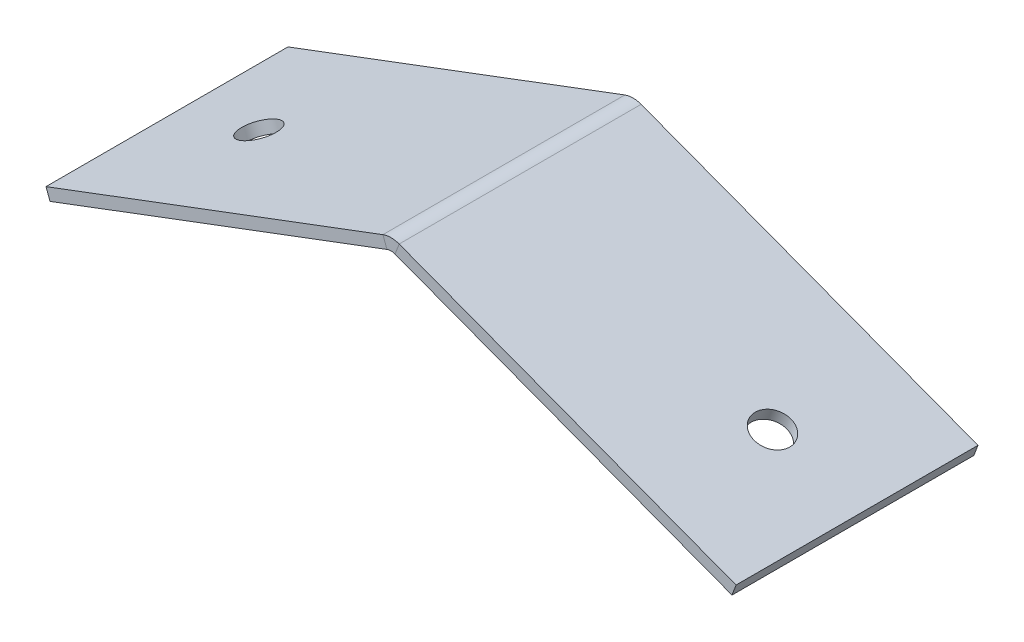
ISO-10303-21;
HEADER;
FILE_DESCRIPTION(('STEP AP214'),'2;1');
FILE_NAME('part.step','',(''),(''),'','','');
FILE_SCHEMA(('AUTOMOTIVE_DESIGN { 1 0 10303 214 1 1 1 1 }'));
ENDSEC;
DATA;
#1=APPLICATION_CONTEXT('core data for automotive mechanical design processes');
#2=APPLICATION_PROTOCOL_DEFINITION('international standard','automotive_design',2000,#1);
#3=PRODUCT_CONTEXT('',#1,'mechanical');
#4=PRODUCT('Part','Part','',(#3));
#5=PRODUCT_RELATED_PRODUCT_CATEGORY('part','',(#4));
#6=PRODUCT_DEFINITION_FORMATION('','',#4);
#7=PRODUCT_DEFINITION_CONTEXT('part definition',#1,'design');
#8=PRODUCT_DEFINITION('design','',#6,#7);
#9=PRODUCT_DEFINITION_SHAPE('','',#8);
#10=(LENGTH_UNIT() NAMED_UNIT(*) SI_UNIT(.MILLI.,.METRE.));
#11=(NAMED_UNIT(*) PLANE_ANGLE_UNIT() SI_UNIT($,.RADIAN.));
#12=(NAMED_UNIT(*) SI_UNIT($,.STERADIAN.) SOLID_ANGLE_UNIT());
#13=UNCERTAINTY_MEASURE_WITH_UNIT(LENGTH_MEASURE(1.E-05),#10,'distance_accuracy_value','');
#14=(GEOMETRIC_REPRESENTATION_CONTEXT(3) GLOBAL_UNCERTAINTY_ASSIGNED_CONTEXT((#13)) GLOBAL_UNIT_ASSIGNED_CONTEXT((#10,
#11,#12)) REPRESENTATION_CONTEXT('',''));
#15=CARTESIAN_POINT('',(0.,0.,0.));
#16=DIRECTION('',(0.,0.,1.));
#17=DIRECTION('',(1.,0.,0.));
#18=AXIS2_PLACEMENT_3D('',#15,#16,#17);
#19=CARTESIAN_POINT('',(48.6611125360654,17.477308656517,16.66875));
#20=DIRECTION('',(0.,0.,1.));
#21=DIRECTION('',(1.,0.,0.));
#22=AXIS2_PLACEMENT_3D('',#19,#20,#21);
#23=PLANE('',#22);
#24=DIRECTION('',(-0.352331719779417,-0.935875183578066,0.));
#25=VECTOR('',#24,1.);
#26=CARTESIAN_POINT('',(48.6611125360654,17.477308656517,16.66875));
#27=LINE('',#26,#25);
#28=CARTESIAN_POINT('',(48.6611125360654,17.477308656517,16.66875));
#29=VERTEX_POINT('',#28);
#30=CARTESIAN_POINT('',(48.1017859309156,15.9916068025868,16.66875));
#31=VERTEX_POINT('',#30);
#32=EDGE_CURVE('E11',#29,#31,#27,.T.);
#33=ORIENTED_EDGE('',*,*,#32,.F.);
#34=CARTESIAN_POINT('',(47.5424593257657,14.5059049486566,16.66875));
#35=DIRECTION('',(0.,0.,1.));
#36=DIRECTION('',(1.,0.,0.));
#37=AXIS2_PLACEMENT_3D('',#34,#35,#36);
#38=CIRCLE('',#37,3.175);
#39=CARTESIAN_POINT('',(46.4238061154661,17.477308656517,16.66875));
#40=VERTEX_POINT('',#39);
#41=EDGE_CURVE('E133',#40,#29,#38,.F.);
#42=ORIENTED_EDGE('',*,*,#41,.F.);
#43=DIRECTION('',(-0.352331719779419,0.935875183578065,0.));
#44=VECTOR('',#43,1.);
#45=CARTESIAN_POINT('',(46.9831327206159,15.9916068025868,16.66875));
#46=LINE('',#45,#44);
#47=CARTESIAN_POINT('',(46.9831327206159,15.9916068025868,16.66875));
#48=VERTEX_POINT('',#47);
#49=EDGE_CURVE('E44',#48,#40,#46,.T.);
#50=ORIENTED_EDGE('',*,*,#49,.F.);
#51=CARTESIAN_POINT('',(47.5424593257657,14.5059049486566,16.66875));
#52=DIRECTION('',(0.,0.,1.));
#53=DIRECTION('',(1.,0.,0.));
#54=AXIS2_PLACEMENT_3D('',#51,#52,#53);
#55=CIRCLE('',#54,1.5875);
#56=EDGE_CURVE('E126',#48,#31,#55,.F.);
#57=ORIENTED_EDGE('',*,*,#56,.T.);
#58=EDGE_LOOP('',(#33,#42,#50,#57));
#59=FACE_BOUND('',#58,.T.);
#60=ADVANCED_FACE('F36',(#59),#23,.T.);
#61=CARTESIAN_POINT('',(46.9831327206159,15.9916068025868,16.66875));
#62=DIRECTION('',(0.,0.,1.));
#63=DIRECTION('',(1.,0.,0.));
#64=AXIS2_PLACEMENT_3D('',#61,#62,#63);
#65=PLANE('',#64);
#66=DIRECTION('',(0.935875183578066,-0.352331719779416,0.));
#67=VECTOR('',#66,1.);
#68=CARTESIAN_POINT('',(47.5424593257658,17.8984513647943,16.66875));
#69=LINE('',#68,#67);
#70=CARTESIAN_POINT('',(95.0849186515315,0.,16.66875));
#71=VERTEX_POINT('',#70);
#72=EDGE_CURVE('E183',#29,#71,#69,.T.);
#73=ORIENTED_EDGE('',*,*,#72,.F.);
#74=ORIENTED_EDGE('',*,*,#32,.T.);
#75=DIRECTION('',(0.935875183578066,-0.352331719779416,0.));
#76=VECTOR('',#75,1.);
#77=CARTESIAN_POINT('',(46.9831327206159,16.4127495108642,16.66875));
#78=LINE('',#77,#76);
#79=CARTESIAN_POINT('',(94.5255920463817,-1.48570185393019,16.66875));
#80=VERTEX_POINT('',#79);
#81=EDGE_CURVE('E92',#31,#80,#78,.T.);
#82=ORIENTED_EDGE('',*,*,#81,.T.);
#83=DIRECTION('',(-0.352331719779404,-0.935875183578071,0.));
#84=VECTOR('',#83,1.);
#85=CARTESIAN_POINT('',(95.0849186515315,0.,16.66875));
#86=LINE('',#85,#84);
#87=EDGE_CURVE('E379',#71,#80,#86,.T.);
#88=ORIENTED_EDGE('',*,*,#87,.F.);
#89=EDGE_LOOP('',(#73,#74,#82,#88));
#90=FACE_BOUND('',#89,.T.);
#91=ADVANCED_FACE('F191',(#90),#65,.T.);
#92=CARTESIAN_POINT('',(46.4238061154661,17.477308656517,-16.66875));
#93=DIRECTION('',(0.,0.,-1.));
#94=DIRECTION('',(-1.,0.,0.));
#95=AXIS2_PLACEMENT_3D('',#92,#93,#94);
#96=PLANE('',#95);
#97=DIRECTION('',(0.352331719779419,-0.935875183578065,0.));
#98=VECTOR('',#97,1.);
#99=CARTESIAN_POINT('',(46.4238061154661,17.477308656517,-16.66875));
#100=LINE('',#99,#98);
#101=CARTESIAN_POINT('',(46.4238061154661,17.477308656517,-16.66875));
#102=VERTEX_POINT('',#101);
#103=CARTESIAN_POINT('',(46.9831327206159,15.9916068025868,-16.66875));
#104=VERTEX_POINT('',#103);
#105=EDGE_CURVE('E79',#102,#104,#100,.T.);
#106=ORIENTED_EDGE('',*,*,#105,.F.);
#107=CARTESIAN_POINT('',(47.5424593257657,14.5059049486566,-16.66875));
#108=DIRECTION('',(0.,0.,1.));
#109=DIRECTION('',(1.,0.,0.));
#110=AXIS2_PLACEMENT_3D('',#107,#108,#109);
#111=CIRCLE('',#110,3.175);
#112=CARTESIAN_POINT('',(48.6611125360654,17.477308656517,-16.66875));
#113=VERTEX_POINT('',#112);
#114=EDGE_CURVE('E149',#102,#113,#111,.F.);
#115=ORIENTED_EDGE('',*,*,#114,.T.);
#116=DIRECTION('',(0.352331719779417,0.935875183578066,0.));
#117=VECTOR('',#116,1.);
#118=CARTESIAN_POINT('',(48.1017859309156,15.9916068025868,-16.66875));
#119=LINE('',#118,#117);
#120=CARTESIAN_POINT('',(48.1017859309156,15.9916068025868,-16.66875));
#121=VERTEX_POINT('',#120);
#122=EDGE_CURVE('E86',#121,#113,#119,.T.);
#123=ORIENTED_EDGE('',*,*,#122,.F.);
#124=CARTESIAN_POINT('',(47.5424593257657,14.5059049486566,-16.66875));
#125=DIRECTION('',(0.,0.,1.));
#126=DIRECTION('',(1.,0.,0.));
#127=AXIS2_PLACEMENT_3D('',#124,#125,#126);
#128=CIRCLE('',#127,1.5875);
#129=EDGE_CURVE('E156',#104,#121,#128,.F.);
#130=ORIENTED_EDGE('',*,*,#129,.F.);
#131=EDGE_LOOP('',(#106,#115,#123,#130));
#132=FACE_BOUND('',#131,.T.);
#133=ADVANCED_FACE('F189',(#132),#96,.T.);
#134=CARTESIAN_POINT('',(48.1017859309156,15.9916068025868,-16.66875));
#135=DIRECTION('',(0.,0.,-1.));
#136=DIRECTION('',(-1.,0.,0.));
#137=AXIS2_PLACEMENT_3D('',#134,#135,#136);
#138=PLANE('',#137);
#139=DIRECTION('',(0.935875183578066,0.352331719779416,0.));
#140=VECTOR('',#139,1.);
#141=CARTESIAN_POINT('',(0.,0.,-16.66875));
#142=LINE('',#141,#140);
#143=CARTESIAN_POINT('',(0.,0.,-16.66875));
#144=VERTEX_POINT('',#143);
#145=EDGE_CURVE('E151',#144,#102,#142,.T.);
#146=ORIENTED_EDGE('',*,*,#145,.T.);
#147=ORIENTED_EDGE('',*,*,#105,.T.);
#148=DIRECTION('',(0.935875183578066,0.352331719779416,0.));
#149=VECTOR('',#148,1.);
#150=CARTESIAN_POINT('',(0.559326605149823,-1.48570185393018,-16.66875));
#151=LINE('',#150,#149);
#152=CARTESIAN_POINT('',(0.559326605149823,-1.48570185393018,-16.66875));
#153=VERTEX_POINT('',#152);
#154=EDGE_CURVE('E154',#153,#104,#151,.T.);
#155=ORIENTED_EDGE('',*,*,#154,.F.);
#156=DIRECTION('',(-0.352331719779416,0.935875183578066,0.));
#157=VECTOR('',#156,1.);
#158=CARTESIAN_POINT('',(0.559326605149823,-1.48570185393018,-16.66875));
#159=LINE('',#158,#157);
#160=EDGE_CURVE('E114',#153,#144,#159,.T.);
#161=ORIENTED_EDGE('',*,*,#160,.T.);
#162=EDGE_LOOP('',(#146,#147,#155,#161));
#163=FACE_BOUND('',#162,.T.);
#164=ADVANCED_FACE('F185',(#163),#138,.T.);
#165=CARTESIAN_POINT('',(46.9831327206159,16.4127495108642,16.66875));
#166=DIRECTION('',(0.352331719779416,0.935875183578066,0.));
#167=DIRECTION('',(-0.935875183578066,0.352331719779416,0.));
#168=AXIS2_PLACEMENT_3D('',#165,#166,#167);
#169=PLANE('',#168);
#170=CARTESIAN_POINT('',(82.8776895115691,2.89941873044442,0.));
#171=DIRECTION('',(0.352331719779416,0.935875183578066,0.));
#172=DIRECTION('',(-0.935875183578066,0.352331719779416,0.));
#173=AXIS2_PLACEMENT_3D('',#170,#171,#172);
#174=CIRCLE('',#173,2.53999999999999);
#175=CARTESIAN_POINT('',(80.5005665452808,3.79434129868414,0.));
#176=VERTEX_POINT('',#175);
#177=EDGE_CURVE('E366',#176,#176,#174,.T.);
#178=ORIENTED_EDGE('',*,*,#177,.T.);
#179=EDGE_LOOP('',(#178));
#180=FACE_BOUND('',#179,.T.);
#181=DIRECTION('',(0.935875183578066,-0.352331719779416,0.));
#182=VECTOR('',#181,1.);
#183=CARTESIAN_POINT('',(46.9831327206159,16.4127495108642,-16.66875));
#184=LINE('',#183,#182);
#185=CARTESIAN_POINT('',(94.5255920463817,-1.48570185393019,-16.66875));
#186=VERTEX_POINT('',#185);
#187=EDGE_CURVE('E139',#121,#186,#184,.T.);
#188=ORIENTED_EDGE('',*,*,#187,.T.);
#189=DIRECTION('',(0.,0.,-1.));
#190=VECTOR('',#189,1.);
#191=CARTESIAN_POINT('',(94.5255920463817,-1.48570185393019,16.66875));
#192=LINE('',#191,#190);
#193=EDGE_CURVE('E170',#80,#186,#192,.T.);
#194=ORIENTED_EDGE('',*,*,#193,.F.);
#195=ORIENTED_EDGE('',*,*,#81,.F.);
#196=DIRECTION('',(0.,0.,-1.));
#197=VECTOR('',#196,1.);
#198=CARTESIAN_POINT('',(48.1017859309156,15.9916068025868,16.66875));
#199=LINE('',#198,#197);
#200=EDGE_CURVE('E138',#31,#121,#199,.T.);
#201=ORIENTED_EDGE('',*,*,#200,.T.);
#202=EDGE_LOOP('',(#188,#194,#195,#201));
#203=FACE_BOUND('',#202,.T.);
#204=ADVANCED_FACE('F197',(#180,#203),#169,.F.);
#205=CARTESIAN_POINT('',(95.0849186515315,0.,16.66875));
#206=DIRECTION('',(0.93587518357807,-0.352331719779404,0.));
#207=DIRECTION('',(0.352331719779404,0.935875183578071,0.));
#208=AXIS2_PLACEMENT_3D('',#205,#206,#207);
#209=PLANE('',#208);
#210=DIRECTION('',(-0.352331719779404,-0.935875183578071,0.));
#211=VECTOR('',#210,1.);
#212=CARTESIAN_POINT('',(95.0849186515315,0.,-16.66875));
#213=LINE('',#212,#211);
#214=CARTESIAN_POINT('',(95.0849186515315,0.,-16.66875));
#215=VERTEX_POINT('',#214);
#216=EDGE_CURVE('E142',#215,#186,#213,.T.);
#217=ORIENTED_EDGE('',*,*,#216,.F.);
#218=DIRECTION('',(0.,0.,-1.));
#219=VECTOR('',#218,1.);
#220=CARTESIAN_POINT('',(95.0849186515315,0.,16.66875));
#221=LINE('',#220,#219);
#222=EDGE_CURVE('E168',#71,#215,#221,.T.);
#223=ORIENTED_EDGE('',*,*,#222,.F.);
#224=ORIENTED_EDGE('',*,*,#87,.T.);
#225=ORIENTED_EDGE('',*,*,#193,.T.);
#226=EDGE_LOOP('',(#217,#223,#224,#225));
#227=FACE_BOUND('',#226,.T.);
#228=ADVANCED_FACE('F226',(#227),#209,.T.);
#229=CARTESIAN_POINT('',(47.5424593257658,17.8984513647943,16.66875));
#230=DIRECTION('',(0.352331719779416,0.935875183578066,0.));
#231=DIRECTION('',(-0.935875183578066,0.352331719779416,0.));
#232=AXIS2_PLACEMENT_3D('',#229,#230,#231);
#233=PLANE('',#232);
#234=CARTESIAN_POINT('',(83.4370161167189,4.3851205843746,0.));
#235=DIRECTION('',(0.352331719779416,0.935875183578066,0.));
#236=DIRECTION('',(-0.935875183578066,0.352331719779416,0.));
#237=AXIS2_PLACEMENT_3D('',#234,#235,#236);
#238=CIRCLE('',#237,2.53999999999999);
#239=CARTESIAN_POINT('',(81.0598931504306,5.28004315261432,0.));
#240=VERTEX_POINT('',#239);
#241=EDGE_CURVE('E369',#240,#240,#238,.T.);
#242=ORIENTED_EDGE('',*,*,#241,.F.);
#243=EDGE_LOOP('',(#242));
#244=FACE_BOUND('',#243,.T.);
#245=DIRECTION('',(0.935875183578066,-0.352331719779416,0.));
#246=VECTOR('',#245,1.);
#247=CARTESIAN_POINT('',(47.5424593257658,17.8984513647943,-16.66875));
#248=LINE('',#247,#246);
#249=EDGE_CURVE('E146',#113,#215,#248,.T.);
#250=ORIENTED_EDGE('',*,*,#249,.F.);
#251=DIRECTION('',(0.,0.,-1.));
#252=VECTOR('',#251,1.);
#253=CARTESIAN_POINT('',(48.6611125360654,17.477308656517,16.66875));
#254=LINE('',#253,#252);
#255=EDGE_CURVE('E165',#29,#113,#254,.T.);
#256=ORIENTED_EDGE('',*,*,#255,.F.);
#257=ORIENTED_EDGE('',*,*,#72,.T.);
#258=ORIENTED_EDGE('',*,*,#222,.T.);
#259=EDGE_LOOP('',(#250,#256,#257,#258));
#260=FACE_BOUND('',#259,.T.);
#261=ADVANCED_FACE('F231',(#244,#260),#233,.T.);
#262=CARTESIAN_POINT('',(47.5424593257657,14.5059049486566,16.66875));
#263=DIRECTION('',(0.,0.,-1.));
#264=DIRECTION('',(-1.,0.,0.));
#265=AXIS2_PLACEMENT_3D('',#262,#263,#264);
#266=CYLINDRICAL_SURFACE('',#265,3.175);
#267=ORIENTED_EDGE('',*,*,#114,.F.);
#268=DIRECTION('',(0.,0.,-1.));
#269=VECTOR('',#268,1.);
#270=CARTESIAN_POINT('',(46.4238061154661,17.477308656517,16.66875));
#271=LINE('',#270,#269);
#272=EDGE_CURVE('E162',#40,#102,#271,.T.);
#273=ORIENTED_EDGE('',*,*,#272,.F.);
#274=ORIENTED_EDGE('',*,*,#41,.T.);
#275=ORIENTED_EDGE('',*,*,#255,.T.);
#276=EDGE_LOOP('',(#267,#273,#274,#275));
#277=FACE_BOUND('',#276,.T.);
#278=ADVANCED_FACE('F179',(#277),#266,.T.);
#279=CARTESIAN_POINT('',(0.,0.,16.66875));
#280=DIRECTION('',(-0.352331719779416,0.935875183578066,0.));
#281=DIRECTION('',(-0.935875183578066,-0.352331719779416,0.));
#282=AXIS2_PLACEMENT_3D('',#279,#280,#281);
#283=PLANE('',#282);
#284=CARTESIAN_POINT('',(12.6686599941724,4.76940818751299,0.));
#285=DIRECTION('',(-0.352331719779416,0.935875183578066,0.));
#286=DIRECTION('',(-0.935875183578066,-0.352331719779416,0.));
#287=AXIS2_PLACEMENT_3D('',#284,#285,#286);
#288=CIRCLE('',#287,2.54);
#289=CARTESIAN_POINT('',(10.2915370278841,3.87448561927327,0.));
#290=VERTEX_POINT('',#289);
#291=EDGE_CURVE('E371',#290,#290,#288,.T.);
#292=ORIENTED_EDGE('',*,*,#291,.F.);
#293=EDGE_LOOP('',(#292));
#294=FACE_BOUND('',#293,.T.);
#295=ORIENTED_EDGE('',*,*,#145,.F.);
#296=DIRECTION('',(0.,0.,-1.));
#297=VECTOR('',#296,1.);
#298=CARTESIAN_POINT('',(0.,0.,16.66875));
#299=LINE('',#298,#297);
#300=CARTESIAN_POINT('',(0.,0.,16.66875));
#301=VERTEX_POINT('',#300);
#302=EDGE_CURVE('E116',#301,#144,#299,.T.);
#303=ORIENTED_EDGE('',*,*,#302,.F.);
#304=DIRECTION('',(0.935875183578066,0.352331719779416,0.));
#305=VECTOR('',#304,1.);
#306=CARTESIAN_POINT('',(0.,0.,16.66875));
#307=LINE('',#306,#305);
#308=EDGE_CURVE('E131',#301,#40,#307,.T.);
#309=ORIENTED_EDGE('',*,*,#308,.T.);
#310=ORIENTED_EDGE('',*,*,#272,.T.);
#311=EDGE_LOOP('',(#295,#303,#309,#310));
#312=FACE_BOUND('',#311,.T.);
#313=ADVANCED_FACE('F184',(#294,#312),#283,.T.);
#314=CARTESIAN_POINT('',(0.559326605149823,-1.48570185393018,16.66875));
#315=DIRECTION('',(-0.935875183578066,-0.352331719779416,0.));
#316=DIRECTION('',(0.352331719779416,-0.935875183578066,0.));
#317=AXIS2_PLACEMENT_3D('',#314,#315,#316);
#318=PLANE('',#317);
#319=ORIENTED_EDGE('',*,*,#160,.F.);
#320=DIRECTION('',(0.,0.,-1.));
#321=VECTOR('',#320,1.);
#322=CARTESIAN_POINT('',(0.559326605149823,-1.48570185393018,16.66875));
#323=LINE('',#322,#321);
#324=CARTESIAN_POINT('',(0.559326605149823,-1.48570185393018,16.66875));
#325=VERTEX_POINT('',#324);
#326=EDGE_CURVE('E108',#325,#153,#323,.T.);
#327=ORIENTED_EDGE('',*,*,#326,.F.);
#328=DIRECTION('',(-0.352331719779416,0.935875183578066,0.));
#329=VECTOR('',#328,1.);
#330=CARTESIAN_POINT('',(0.559326605149823,-1.48570185393018,16.66875));
#331=LINE('',#330,#329);
#332=EDGE_CURVE('E112',#325,#301,#331,.T.);
#333=ORIENTED_EDGE('',*,*,#332,.T.);
#334=ORIENTED_EDGE('',*,*,#302,.T.);
#335=EDGE_LOOP('',(#319,#327,#333,#334));
#336=FACE_BOUND('',#335,.T.);
#337=ADVANCED_FACE('F110',(#336),#318,.T.);
#338=CARTESIAN_POINT('',(0.559326605149823,-1.48570185393018,16.66875));
#339=DIRECTION('',(-0.352331719779416,0.935875183578066,0.));
#340=DIRECTION('',(-0.935875183578066,-0.352331719779416,0.));
#341=AXIS2_PLACEMENT_3D('',#338,#339,#340);
#342=PLANE('',#341);
#343=CARTESIAN_POINT('',(13.2279865993222,3.28370633358281,0.));
#344=DIRECTION('',(-0.352331719779416,0.935875183578066,0.));
#345=DIRECTION('',(-0.935875183578066,-0.352331719779416,0.));
#346=AXIS2_PLACEMENT_3D('',#343,#344,#345);
#347=CIRCLE('',#346,2.54);
#348=CARTESIAN_POINT('',(10.8508636330339,2.3887837653431,0.));
#349=VERTEX_POINT('',#348);
#350=EDGE_CURVE('E143',#349,#349,#347,.T.);
#351=ORIENTED_EDGE('',*,*,#350,.T.);
#352=EDGE_LOOP('',(#351));
#353=FACE_BOUND('',#352,.T.);
#354=ORIENTED_EDGE('',*,*,#154,.T.);
#355=DIRECTION('',(0.,0.,-1.));
#356=VECTOR('',#355,1.);
#357=CARTESIAN_POINT('',(46.9831327206159,15.9916068025868,16.66875));
#358=LINE('',#357,#356);
#359=EDGE_CURVE('E117',#48,#104,#358,.T.);
#360=ORIENTED_EDGE('',*,*,#359,.F.);
#361=DIRECTION('',(0.935875183578066,0.352331719779416,0.));
#362=VECTOR('',#361,1.);
#363=CARTESIAN_POINT('',(0.559326605149823,-1.48570185393018,16.66875));
#364=LINE('',#363,#362);
#365=EDGE_CURVE('E121',#325,#48,#364,.T.);
#366=ORIENTED_EDGE('',*,*,#365,.F.);
#367=ORIENTED_EDGE('',*,*,#326,.T.);
#368=EDGE_LOOP('',(#354,#360,#366,#367));
#369=FACE_BOUND('',#368,.T.);
#370=ADVANCED_FACE('F122',(#353,#369),#342,.F.);
#371=CARTESIAN_POINT('',(47.5424593257657,14.5059049486566,16.66875));
#372=DIRECTION('',(0.,0.,-1.));
#373=DIRECTION('',(-1.,0.,0.));
#374=AXIS2_PLACEMENT_3D('',#371,#372,#373);
#375=CYLINDRICAL_SURFACE('',#374,1.5875);
#376=ORIENTED_EDGE('',*,*,#129,.T.);
#377=ORIENTED_EDGE('',*,*,#200,.F.);
#378=ORIENTED_EDGE('',*,*,#56,.F.);
#379=ORIENTED_EDGE('',*,*,#359,.T.);
#380=EDGE_LOOP('',(#376,#377,#378,#379));
#381=FACE_BOUND('',#380,.T.);
#382=ADVANCED_FACE('F187',(#381),#375,.F.);
#383=CARTESIAN_POINT('',(47.5424593257657,14.5059049486566,16.66875));
#384=DIRECTION('',(0.,0.,1.));
#385=DIRECTION('',(1.,0.,0.));
#386=AXIS2_PLACEMENT_3D('',#383,#384,#385);
#387=PLANE('',#386);
#388=ORIENTED_EDGE('',*,*,#365,.T.);
#389=ORIENTED_EDGE('',*,*,#49,.T.);
#390=ORIENTED_EDGE('',*,*,#308,.F.);
#391=ORIENTED_EDGE('',*,*,#332,.F.);
#392=EDGE_LOOP('',(#388,#389,#390,#391));
#393=FACE_BOUND('',#392,.T.);
#394=ADVANCED_FACE('F129',(#393),#387,.T.);
#395=CARTESIAN_POINT('',(47.5424593257657,14.5059049486566,-16.66875));
#396=DIRECTION('',(0.,0.,1.));
#397=DIRECTION('',(1.,0.,0.));
#398=AXIS2_PLACEMENT_3D('',#395,#396,#397);
#399=PLANE('',#398);
#400=ORIENTED_EDGE('',*,*,#187,.F.);
#401=ORIENTED_EDGE('',*,*,#122,.T.);
#402=ORIENTED_EDGE('',*,*,#249,.T.);
#403=ORIENTED_EDGE('',*,*,#216,.T.);
#404=EDGE_LOOP('',(#400,#401,#402,#403));
#405=FACE_BOUND('',#404,.T.);
#406=ADVANCED_FACE('F275',(#405),#399,.F.);
#407=CARTESIAN_POINT('',(13.2279865993222,3.28370633358281,0.));
#408=DIRECTION('',(-0.352331719779416,0.935875183578066,0.));
#409=DIRECTION('',(-0.935875183578066,-0.352331719779416,0.));
#410=AXIS2_PLACEMENT_3D('',#407,#408,#409);
#411=CYLINDRICAL_SURFACE('',#410,2.54);
#412=ORIENTED_EDGE('',*,*,#350,.F.);
#413=EDGE_LOOP('',(#412));
#414=FACE_BOUND('',#413,.T.);
#415=ORIENTED_EDGE('',*,*,#291,.T.);
#416=EDGE_LOOP('',(#415));
#417=FACE_BOUND('',#416,.T.);
#418=ADVANCED_FACE('F285',(#414,#417),#411,.F.);
#419=CARTESIAN_POINT('',(82.8776895115691,2.89941873044442,0.));
#420=DIRECTION('',(0.352331719779416,0.935875183578066,0.));
#421=DIRECTION('',(-0.935875183578066,0.352331719779416,0.));
#422=AXIS2_PLACEMENT_3D('',#419,#420,#421);
#423=CYLINDRICAL_SURFACE('',#422,2.53999999999999);
#424=ORIENTED_EDGE('',*,*,#177,.F.);
#425=EDGE_LOOP('',(#424));
#426=FACE_BOUND('',#425,.T.);
#427=ORIENTED_EDGE('',*,*,#241,.T.);
#428=EDGE_LOOP('',(#427));
#429=FACE_BOUND('',#428,.T.);
#430=ADVANCED_FACE('F312',(#426,#429),#423,.F.);
#431=CLOSED_SHELL('',(#60,#91,#133,#164,#204,#228,#261,#278,#313,#337,#370,#382,#394,#406,#418,#430));
#432=MANIFOLD_SOLID_BREP('B2',#431);
#433=ADVANCED_BREP_SHAPE_REPRESENTATION('',(#18,#432),#14);
#434=SHAPE_DEFINITION_REPRESENTATION(#9,#433);
ENDSEC;
END-ISO-10303-21;
